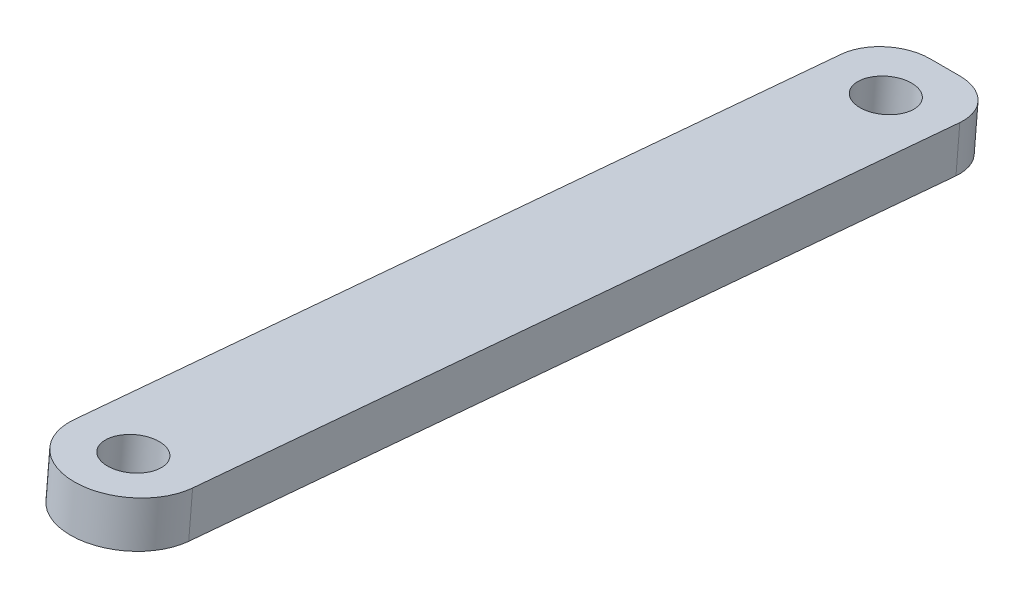
ISO-10303-21;
HEADER;
FILE_DESCRIPTION(('STEP AP214'),'2;1');
FILE_NAME('part.step','',(''),(''),'','','');
FILE_SCHEMA(('AUTOMOTIVE_DESIGN { 1 0 10303 214 1 1 1 1 }'));
ENDSEC;
DATA;
#1=APPLICATION_CONTEXT('core data for automotive mechanical design processes');
#2=APPLICATION_PROTOCOL_DEFINITION('international standard','automotive_design',2000,#1);
#3=PRODUCT_CONTEXT('',#1,'mechanical');
#4=PRODUCT('Part','Part','',(#3));
#5=PRODUCT_RELATED_PRODUCT_CATEGORY('part','',(#4));
#6=PRODUCT_DEFINITION_FORMATION('','',#4);
#7=PRODUCT_DEFINITION_CONTEXT('part definition',#1,'design');
#8=PRODUCT_DEFINITION('design','',#6,#7);
#9=PRODUCT_DEFINITION_SHAPE('','',#8);
#10=(LENGTH_UNIT() NAMED_UNIT(*) SI_UNIT(.MILLI.,.METRE.));
#11=(NAMED_UNIT(*) PLANE_ANGLE_UNIT() SI_UNIT($,.RADIAN.));
#12=(NAMED_UNIT(*) SI_UNIT($,.STERADIAN.) SOLID_ANGLE_UNIT());
#13=UNCERTAINTY_MEASURE_WITH_UNIT(LENGTH_MEASURE(1.E-05),#10,'distance_accuracy_value','');
#14=(GEOMETRIC_REPRESENTATION_CONTEXT(3) GLOBAL_UNCERTAINTY_ASSIGNED_CONTEXT((#13)) GLOBAL_UNIT_ASSIGNED_CONTEXT((#10,
#11,#12)) REPRESENTATION_CONTEXT('',''));
#15=CARTESIAN_POINT('',(0.,0.,0.));
#16=DIRECTION('',(0.,0.,1.));
#17=DIRECTION('',(1.,0.,0.));
#18=AXIS2_PLACEMENT_3D('',#15,#16,#17);
#19=CARTESIAN_POINT('',(-45.0000008940697,34.5343344203041,15.5899580294414));
#20=DIRECTION('',(0.,-0.996194698091746,0.0871557427476581));
#21=DIRECTION('',(-1.,0.,0.));
#22=AXIS2_PLACEMENT_3D('',#19,#20,#21);
#23=PLANE('',#22);
#24=CARTESIAN_POINT('',(-45.0000008940697,36.7132280117232,40.4948257415131));
#25=DIRECTION('',(0.,0.996194698091746,-0.0871557427476581));
#26=DIRECTION('',(1.,0.,0.));
#27=AXIS2_PLACEMENT_3D('',#24,#25,#26);
#28=CIRCLE('',#27,1.75);
#29=CARTESIAN_POINT('',(-46.7500008940697,36.7132280117232,40.4948257415131));
#30=VERTEX_POINT('',#29);
#31=EDGE_CURVE('E141',#30,#30,#28,.T.);
#32=ORIENTED_EDGE('',*,*,#31,.T.);
#33=EDGE_LOOP('',(#32));
#34=FACE_BOUND('',#33,.T.);
#35=CARTESIAN_POINT('',(-45.0000006705522,32.2682850653578,-10.3111046182333));
#36=DIRECTION('',(0.,0.996194698091746,-0.0871557427476581));
#37=DIRECTION('',(1.,0.,0.));
#38=AXIS2_PLACEMENT_3D('',#35,#36,#37);
#39=CIRCLE('',#38,1.75);
#40=CARTESIAN_POINT('',(-46.7500006705522,32.2682850653578,-10.3111046182333));
#41=VERTEX_POINT('',#40);
#42=EDGE_CURVE('E40',#41,#41,#39,.T.);
#43=ORIENTED_EDGE('',*,*,#42,.T.);
#44=EDGE_LOOP('',(#43));
#45=FACE_BOUND('',#44,.T.);
#46=CARTESIAN_POINT('',(-44.0000006109476,32.181129318714,-11.3072993608584));
#47=DIRECTION('',(0.,0.996194698091746,-0.087155742747658));
#48=DIRECTION('',(0.707106781186545,-0.0616284167162194,-0.704416026402761));
#49=AXIS2_PLACEMENT_3D('',#46,#47,#48);
#50=CIRCLE('',#49,3.);
#51=CARTESIAN_POINT('',(-41.0000006109476,32.181129318714,-11.3072993608584));
#52=VERTEX_POINT('',#51);
#53=CARTESIAN_POINT('',(-44.0000006109476,31.919662090471,-14.2958834551336));
#54=VERTEX_POINT('',#53);
#55=EDGE_CURVE('E163',#52,#54,#50,.T.);
#56=ORIENTED_EDGE('',*,*,#55,.F.);
#57=DIRECTION('',(0.,0.0871557427476581,0.996194698091746));
#58=VECTOR('',#57,1.);
#59=CARTESIAN_POINT('',(-41.0000006109476,41.4196381902277,94.2893402400681));
#60=LINE('',#59,#58);
#61=CARTESIAN_POINT('',(-41.0000006109476,36.7132280117232,40.4948257415131));
#62=VERTEX_POINT('',#61);
#63=EDGE_CURVE('E133',#52,#62,#60,.T.);
#64=ORIENTED_EDGE('',*,*,#63,.T.);
#65=CARTESIAN_POINT('',(-45.0000008940697,36.7132280117232,40.4948257415131));
#66=DIRECTION('',(0.,-0.996194698091746,0.0871557427476581));
#67=DIRECTION('',(1.,0.,0.));
#68=AXIS2_PLACEMENT_3D('',#65,#66,#67);
#69=CIRCLE('',#68,4.00000028312206);
#70=CARTESIAN_POINT('',(-49.0000011771917,36.7132280117232,40.4948257415131));
#71=VERTEX_POINT('',#70);
#72=EDGE_CURVE('E11',#62,#71,#69,.T.);
#73=ORIENTED_EDGE('',*,*,#72,.T.);
#74=DIRECTION('',(0.,-0.0871557427476581,-0.996194698091746));
#75=VECTOR('',#74,1.);
#76=CARTESIAN_POINT('',(-49.0000011771917,32.0068178332187,-13.2996887570419));
#77=LINE('',#76,#75);
#78=CARTESIAN_POINT('',(-49.0000011771917,32.181129318714,-11.3072993608584));
#79=VERTEX_POINT('',#78);
#80=EDGE_CURVE('E114',#71,#79,#77,.T.);
#81=ORIENTED_EDGE('',*,*,#80,.T.);
#82=CARTESIAN_POINT('',(-46.0000011771917,32.181129318714,-11.3072993608584));
#83=DIRECTION('',(0.,0.996194698091746,-0.087155742747658));
#84=DIRECTION('',(-0.707106781186548,-0.0616284167162192,-0.704416026402759));
#85=AXIS2_PLACEMENT_3D('',#82,#83,#84);
#86=CIRCLE('',#85,3.);
#87=CARTESIAN_POINT('',(-46.0000011771917,31.919662090471,-14.2958834551336));
#88=VERTEX_POINT('',#87);
#89=EDGE_CURVE('E116',#88,#79,#86,.T.);
#90=ORIENTED_EDGE('',*,*,#89,.F.);
#91=DIRECTION('',(1.,0.,0.));
#92=VECTOR('',#91,1.);
#93=CARTESIAN_POINT('',(-47.0000010356307,31.919662090471,-14.2958834551336));
#94=LINE('',#93,#92);
#95=EDGE_CURVE('E46',#88,#54,#94,.T.);
#96=ORIENTED_EDGE('',*,*,#95,.T.);
#97=EDGE_LOOP('',(#56,#64,#73,#81,#90,#96));
#98=FACE_BOUND('',#97,.T.);
#99=ADVANCED_FACE('F36',(#34,#45,#98),#23,.T.);
#100=CARTESIAN_POINT('',(-45.0000008940697,39.7018121059985,40.2333585132701));
#101=DIRECTION('',(0.,-0.996194698091746,0.0871557427476581));
#102=DIRECTION('',(1.,0.,0.));
#103=AXIS2_PLACEMENT_3D('',#100,#101,#102);
#104=CYLINDRICAL_SURFACE('',#103,4.00000028312206);
#105=CARTESIAN_POINT('',(-45.0000008940697,39.7018121059985,40.2333585132701));
#106=DIRECTION('',(0.,-0.996194698091746,0.0871557427476581));
#107=DIRECTION('',(1.,0.,0.));
#108=AXIS2_PLACEMENT_3D('',#105,#106,#107);
#109=CIRCLE('',#108,4.00000028312206);
#110=CARTESIAN_POINT('',(-41.0000006109476,39.7018121059985,40.2333585132701));
#111=VERTEX_POINT('',#110);
#112=CARTESIAN_POINT('',(-49.0000011771917,39.7018121059985,40.2333585132701));
#113=VERTEX_POINT('',#112);
#114=EDGE_CURVE('E80',#111,#113,#109,.T.);
#115=ORIENTED_EDGE('',*,*,#114,.T.);
#116=DIRECTION('',(0.,-0.996194698091746,0.0871557427476581));
#117=VECTOR('',#116,1.);
#118=CARTESIAN_POINT('',(-49.0000011771917,39.7018121059985,40.2333585132701));
#119=LINE('',#118,#117);
#120=EDGE_CURVE('E118',#113,#71,#119,.T.);
#121=ORIENTED_EDGE('',*,*,#120,.T.);
#122=ORIENTED_EDGE('',*,*,#72,.F.);
#123=DIRECTION('',(0.,-0.996194698091746,0.0871557427476581));
#124=VECTOR('',#123,1.);
#125=CARTESIAN_POINT('',(-41.0000006109476,39.7018121059985,40.2333585132701));
#126=LINE('',#125,#124);
#127=EDGE_CURVE('E130',#111,#62,#126,.T.);
#128=ORIENTED_EDGE('',*,*,#127,.F.);
#129=EDGE_LOOP('',(#115,#121,#122,#128));
#130=FACE_BOUND('',#129,.T.);
#131=ADVANCED_FACE('F38',(#130),#104,.T.);
#132=CARTESIAN_POINT('',(-49.0000011771917,34.9082461847463,-14.5573506833766));
#133=DIRECTION('',(0.,-0.0871557427476581,-0.996194698091746));
#134=DIRECTION('',(0.,-0.996194698091746,0.0871557427476581));
#135=AXIS2_PLACEMENT_3D('',#132,#133,#134);
#136=PLANE('',#135);
#137=DIRECTION('',(0.,0.996194698091746,-0.0871557427476581));
#138=VECTOR('',#137,1.);
#139=CARTESIAN_POINT('',(-44.0000006109476,34.9082461847463,-14.5573506833766));
#140=LINE('',#139,#138);
#141=CARTESIAN_POINT('',(-44.0000006109476,34.9082461847463,-14.5573506833766));
#142=VERTEX_POINT('',#141);
#143=EDGE_CURVE('E150',#54,#142,#140,.T.);
#144=ORIENTED_EDGE('',*,*,#143,.F.);
#145=ORIENTED_EDGE('',*,*,#95,.F.);
#146=DIRECTION('',(0.,-0.996194698091746,0.0871557427476581));
#147=VECTOR('',#146,1.);
#148=CARTESIAN_POINT('',(-46.0000011771917,34.9082461847463,-14.5573506833766));
#149=LINE('',#148,#147);
#150=CARTESIAN_POINT('',(-46.0000011771917,34.9082461847463,-14.5573506833766));
#151=VERTEX_POINT('',#150);
#152=EDGE_CURVE('E91',#151,#88,#149,.T.);
#153=ORIENTED_EDGE('',*,*,#152,.F.);
#154=DIRECTION('',(-1.,0.,0.));
#155=VECTOR('',#154,1.);
#156=CARTESIAN_POINT('',(-47.0000010356307,34.9082461847463,-14.5573506833766));
#157=LINE('',#156,#155);
#158=EDGE_CURVE('E147',#142,#151,#157,.T.);
#159=ORIENTED_EDGE('',*,*,#158,.F.);
#160=EDGE_LOOP('',(#144,#145,#153,#159));
#161=FACE_BOUND('',#160,.T.);
#162=ADVANCED_FACE('F175',(#161),#136,.T.);
#163=CARTESIAN_POINT('',(-45.0000008940697,39.7018121059985,40.2333585132701));
#164=DIRECTION('',(0.,-0.996194698091746,0.0871557427476581));
#165=DIRECTION('',(1.,0.,0.));
#166=AXIS2_PLACEMENT_3D('',#163,#164,#165);
#167=CYLINDRICAL_SURFACE('',#166,1.75);
#168=ORIENTED_EDGE('',*,*,#31,.F.);
#169=DIRECTION('',(0.,0.996194698091746,-0.0871557427476581));
#170=VECTOR('',#169,1.);
#171=CARTESIAN_POINT('',(-46.7500008940697,39.7018121059985,40.2333585132701));
#172=LINE('',#171,#170);
#173=CARTESIAN_POINT('',(-46.7500008940697,39.7018121059985,40.2333585132701));
#174=VERTEX_POINT('',#173);
#175=EDGE_CURVE('E54',#30,#174,#172,.T.);
#176=ORIENTED_EDGE('',*,*,#175,.T.);
#177=CARTESIAN_POINT('',(-45.0000008940697,39.7018121059985,40.2333585132701));
#178=DIRECTION('',(0.,0.996194698091746,-0.0871557427476581));
#179=DIRECTION('',(1.,0.,0.));
#180=AXIS2_PLACEMENT_3D('',#177,#178,#179);
#181=CIRCLE('',#180,1.75);
#182=EDGE_CURVE('E125',#174,#174,#181,.T.);
#183=ORIENTED_EDGE('',*,*,#182,.T.);
#184=ORIENTED_EDGE('',*,*,#175,.F.);
#185=EDGE_LOOP('',(#168,#176,#183,#184));
#186=FACE_BOUND('',#185,.T.);
#187=ADVANCED_FACE('F177',(#186),#167,.F.);
#188=CARTESIAN_POINT('',(-45.0000006705522,32.2682850653578,-10.3111046182333));
#189=DIRECTION('',(0.,0.996194698091746,-0.0871557427476581));
#190=DIRECTION('',(1.,0.,0.));
#191=AXIS2_PLACEMENT_3D('',#188,#189,#190);
#192=CYLINDRICAL_SURFACE('',#191,1.75);
#193=ORIENTED_EDGE('',*,*,#42,.F.);
#194=DIRECTION('',(0.,0.996194698091746,-0.0871557427476581));
#195=VECTOR('',#194,1.);
#196=CARTESIAN_POINT('',(-46.7500006705522,32.2682850653578,-10.3111046182333));
#197=LINE('',#196,#195);
#198=CARTESIAN_POINT('',(-46.7500006705522,35.2568691596331,-10.5725718464763));
#199=VERTEX_POINT('',#198);
#200=EDGE_CURVE('E154',#41,#199,#197,.T.);
#201=ORIENTED_EDGE('',*,*,#200,.T.);
#202=CARTESIAN_POINT('',(-45.0000006705522,35.2568691596331,-10.5725718464763));
#203=DIRECTION('',(0.,-0.996194698091746,0.0871557427476581));
#204=DIRECTION('',(1.,0.,0.));
#205=AXIS2_PLACEMENT_3D('',#202,#203,#204);
#206=CIRCLE('',#205,1.75);
#207=EDGE_CURVE('E127',#199,#199,#206,.T.);
#208=ORIENTED_EDGE('',*,*,#207,.F.);
#209=ORIENTED_EDGE('',*,*,#200,.F.);
#210=EDGE_LOOP('',(#193,#201,#208,#209));
#211=FACE_BOUND('',#210,.T.);
#212=ADVANCED_FACE('F182',(#211),#192,.F.);
#213=CARTESIAN_POINT('',(-49.0000011771917,39.7018121059985,40.2333585132701));
#214=DIRECTION('',(-1.,0.,0.));
#215=DIRECTION('',(0.,0.,1.));
#216=AXIS2_PLACEMENT_3D('',#213,#214,#215);
#217=PLANE('',#216);
#218=DIRECTION('',(0.,0.996194698091746,-0.0871557427476581));
#219=VECTOR('',#218,1.);
#220=CARTESIAN_POINT('',(-49.0000011771917,35.1697134129893,-11.5687665891014));
#221=LINE('',#220,#219);
#222=CARTESIAN_POINT('',(-49.0000011771917,35.1697134129893,-11.5687665891014));
#223=VERTEX_POINT('',#222);
#224=EDGE_CURVE('E98',#79,#223,#221,.T.);
#225=ORIENTED_EDGE('',*,*,#224,.F.);
#226=ORIENTED_EDGE('',*,*,#80,.F.);
#227=ORIENTED_EDGE('',*,*,#120,.F.);
#228=DIRECTION('',(0.,0.0871557427476581,0.996194698091746));
#229=VECTOR('',#228,1.);
#230=CARTESIAN_POINT('',(-49.0000011771917,34.9954019274939,-13.5611559852849));
#231=LINE('',#230,#229);
#232=EDGE_CURVE('E121',#223,#113,#231,.T.);
#233=ORIENTED_EDGE('',*,*,#232,.F.);
#234=EDGE_LOOP('',(#225,#226,#227,#233));
#235=FACE_BOUND('',#234,.T.);
#236=ADVANCED_FACE('F120',(#235),#217,.T.);
#237=CARTESIAN_POINT('',(-46.0000011771917,35.1697134129893,-11.5687665891014));
#238=DIRECTION('',(0.,-0.996194698091746,0.087155742747658));
#239=DIRECTION('',(-0.707106781186548,-0.0616284167162192,-0.704416026402759));
#240=AXIS2_PLACEMENT_3D('',#237,#238,#239);
#241=CYLINDRICAL_SURFACE('',#240,3.);
#242=ORIENTED_EDGE('',*,*,#89,.T.);
#243=ORIENTED_EDGE('',*,*,#224,.T.);
#244=CARTESIAN_POINT('',(-46.0000011771917,35.1697134129893,-11.5687665891014));
#245=DIRECTION('',(0.,-0.996194698091746,0.087155742747658));
#246=DIRECTION('',(-0.707106781186548,-0.0616284167162192,-0.704416026402759));
#247=AXIS2_PLACEMENT_3D('',#244,#245,#246);
#248=CIRCLE('',#247,3.);
#249=EDGE_CURVE('E145',#223,#151,#248,.T.);
#250=ORIENTED_EDGE('',*,*,#249,.T.);
#251=ORIENTED_EDGE('',*,*,#152,.T.);
#252=EDGE_LOOP('',(#242,#243,#250,#251));
#253=FACE_BOUND('',#252,.T.);
#254=ADVANCED_FACE('F124',(#253),#241,.T.);
#255=CARTESIAN_POINT('',(-45.0000008940697,37.5229185145794,15.3284908011985));
#256=DIRECTION('',(0.,-0.996194698091746,0.0871557427476581));
#257=DIRECTION('',(-1.,0.,0.));
#258=AXIS2_PLACEMENT_3D('',#255,#256,#257);
#259=PLANE('',#258);
#260=ORIENTED_EDGE('',*,*,#182,.F.);
#261=EDGE_LOOP('',(#260));
#262=FACE_BOUND('',#261,.T.);
#263=ORIENTED_EDGE('',*,*,#207,.T.);
#264=EDGE_LOOP('',(#263));
#265=FACE_BOUND('',#264,.T.);
#266=CARTESIAN_POINT('',(-44.0000006109476,35.1697134129893,-11.5687665891014));
#267=DIRECTION('',(0.,-0.996194698091746,0.087155742747658));
#268=DIRECTION('',(0.707106781186545,-0.0616284167162194,-0.704416026402761));
#269=AXIS2_PLACEMENT_3D('',#266,#267,#268);
#270=CIRCLE('',#269,3.);
#271=CARTESIAN_POINT('',(-41.0000006109476,35.1697134129893,-11.5687665891014));
#272=VERTEX_POINT('',#271);
#273=EDGE_CURVE('E138',#142,#272,#270,.T.);
#274=ORIENTED_EDGE('',*,*,#273,.F.);
#275=ORIENTED_EDGE('',*,*,#158,.T.);
#276=ORIENTED_EDGE('',*,*,#249,.F.);
#277=ORIENTED_EDGE('',*,*,#232,.T.);
#278=ORIENTED_EDGE('',*,*,#114,.F.);
#279=DIRECTION('',(0.,-0.0871557427476581,-0.996194698091746));
#280=VECTOR('',#279,1.);
#281=CARTESIAN_POINT('',(-41.0000006109476,44.408222284503,94.0278730118251));
#282=LINE('',#281,#280);
#283=EDGE_CURVE('E134',#111,#272,#282,.T.);
#284=ORIENTED_EDGE('',*,*,#283,.T.);
#285=EDGE_LOOP('',(#274,#275,#276,#277,#278,#284));
#286=FACE_BOUND('',#285,.T.);
#287=ADVANCED_FACE('F174',(#262,#265,#286),#259,.F.);
#288=CARTESIAN_POINT('',(-41.0000006109476,34.9954019274939,-13.5611559852849));
#289=DIRECTION('',(1.,0.,0.));
#290=DIRECTION('',(0.,1.,0.));
#291=AXIS2_PLACEMENT_3D('',#288,#289,#290);
#292=PLANE('',#291);
#293=DIRECTION('',(0.,-0.996194698091746,0.0871557427476581));
#294=VECTOR('',#293,1.);
#295=CARTESIAN_POINT('',(-41.0000006109476,35.1697134129893,-11.5687665891014));
#296=LINE('',#295,#294);
#297=EDGE_CURVE('E135',#272,#52,#296,.T.);
#298=ORIENTED_EDGE('',*,*,#297,.F.);
#299=ORIENTED_EDGE('',*,*,#283,.F.);
#300=ORIENTED_EDGE('',*,*,#127,.T.);
#301=ORIENTED_EDGE('',*,*,#63,.F.);
#302=EDGE_LOOP('',(#298,#299,#300,#301));
#303=FACE_BOUND('',#302,.T.);
#304=ADVANCED_FACE('F171',(#303),#292,.T.);
#305=CARTESIAN_POINT('',(-44.0000006109476,35.1697134129893,-11.5687665891014));
#306=DIRECTION('',(0.,-0.996194698091746,0.087155742747658));
#307=DIRECTION('',(0.707106781186545,-0.0616284167162194,-0.704416026402761));
#308=AXIS2_PLACEMENT_3D('',#305,#306,#307);
#309=CYLINDRICAL_SURFACE('',#308,3.);
#310=ORIENTED_EDGE('',*,*,#55,.T.);
#311=ORIENTED_EDGE('',*,*,#143,.T.);
#312=ORIENTED_EDGE('',*,*,#273,.T.);
#313=ORIENTED_EDGE('',*,*,#297,.T.);
#314=EDGE_LOOP('',(#310,#311,#312,#313));
#315=FACE_BOUND('',#314,.T.);
#316=ADVANCED_FACE('F166',(#315),#309,.T.);
#317=CLOSED_SHELL('',(#99,#131,#162,#187,#212,#236,#254,#287,#304,#316));
#318=MANIFOLD_SOLID_BREP('B2',#317);
#319=ADVANCED_BREP_SHAPE_REPRESENTATION('',(#18,#318),#14);
#320=SHAPE_DEFINITION_REPRESENTATION(#9,#319);
ENDSEC;
END-ISO-10303-21;
